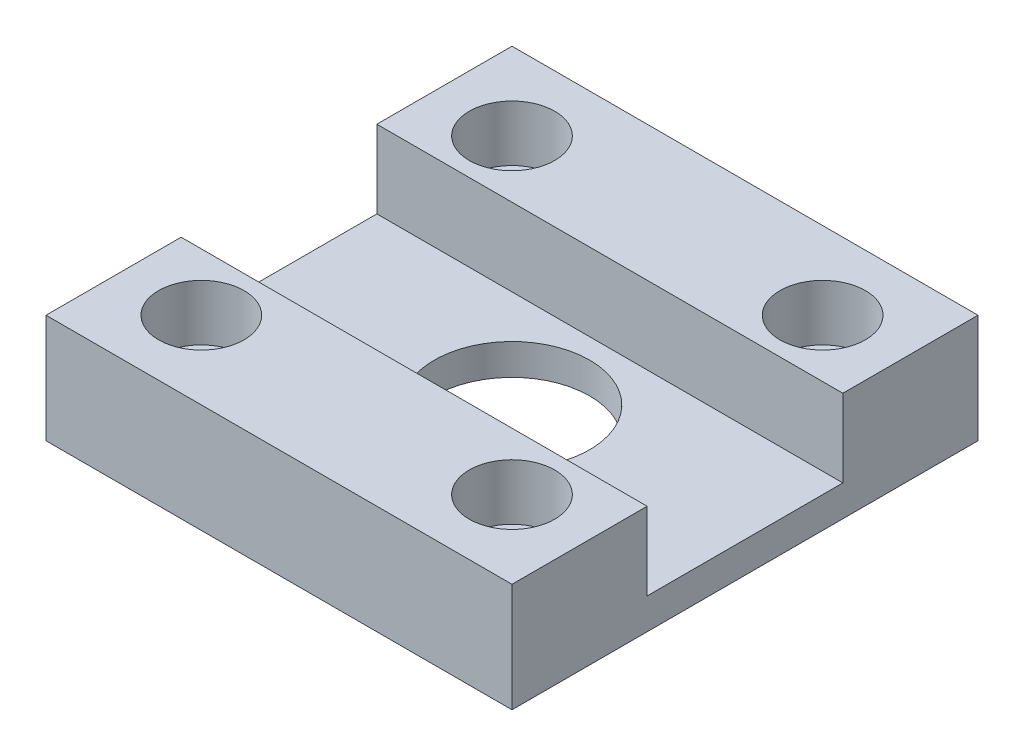
ISO-10303-21;
HEADER;
FILE_DESCRIPTION(('STEP AP214'),'2;1');
FILE_NAME('part.step','',(''),(''),'','','');
FILE_SCHEMA(('AUTOMOTIVE_DESIGN { 1 0 10303 214 1 1 1 1 }'));
ENDSEC;
DATA;
#1=APPLICATION_CONTEXT('core data for automotive mechanical design processes');
#2=APPLICATION_PROTOCOL_DEFINITION('international standard','automotive_design',2000,#1);
#3=PRODUCT_CONTEXT('',#1,'mechanical');
#4=PRODUCT('Part','Part','',(#3));
#5=PRODUCT_RELATED_PRODUCT_CATEGORY('part','',(#4));
#6=PRODUCT_DEFINITION_FORMATION('','',#4);
#7=PRODUCT_DEFINITION_CONTEXT('part definition',#1,'design');
#8=PRODUCT_DEFINITION('design','',#6,#7);
#9=PRODUCT_DEFINITION_SHAPE('','',#8);
#10=(LENGTH_UNIT() NAMED_UNIT(*) SI_UNIT(.MILLI.,.METRE.));
#11=(NAMED_UNIT(*) PLANE_ANGLE_UNIT() SI_UNIT($,.RADIAN.));
#12=(NAMED_UNIT(*) SI_UNIT($,.STERADIAN.) SOLID_ANGLE_UNIT());
#13=UNCERTAINTY_MEASURE_WITH_UNIT(LENGTH_MEASURE(1.E-05),#10,'distance_accuracy_value','');
#14=(GEOMETRIC_REPRESENTATION_CONTEXT(3) GLOBAL_UNCERTAINTY_ASSIGNED_CONTEXT((#13)) GLOBAL_UNIT_ASSIGNED_CONTEXT((#10,
#11,#12)) REPRESENTATION_CONTEXT('',''));
#15=CARTESIAN_POINT('',(0.,0.,0.));
#16=DIRECTION('',(0.,0.,1.));
#17=DIRECTION('',(1.,0.,0.));
#18=AXIS2_PLACEMENT_3D('',#15,#16,#17);
#19=CARTESIAN_POINT('',(0.,2.54,0.));
#20=DIRECTION('',(0.,-1.,0.));
#21=DIRECTION('',(0.,0.,-1.));
#22=AXIS2_PLACEMENT_3D('',#19,#20,#21);
#23=PLANE('',#22);
#24=CARTESIAN_POINT('',(0.,2.54,0.));
#25=DIRECTION('',(0.,1.,0.));
#26=DIRECTION('',(0.,0.,1.));
#27=AXIS2_PLACEMENT_3D('',#24,#25,#26);
#28=CIRCLE('',#27,6.35);
#29=CARTESIAN_POINT('',(0.,2.54,6.35));
#30=VERTEX_POINT('',#29);
#31=EDGE_CURVE('E175',#30,#30,#28,.T.);
#32=ORIENTED_EDGE('',*,*,#31,.F.);
#33=EDGE_LOOP('',(#32));
#34=FACE_BOUND('',#33,.T.);
#35=DIRECTION('',(-1.,0.,0.));
#36=VECTOR('',#35,1.);
#37=CARTESIAN_POINT('',(-19.05,2.54,8.001));
#38=LINE('',#37,#36);
#39=CARTESIAN_POINT('',(19.05,2.54,8.001));
#40=VERTEX_POINT('',#39);
#41=CARTESIAN_POINT('',(-19.05,2.54,8.001));
#42=VERTEX_POINT('',#41);
#43=EDGE_CURVE('E52',#40,#42,#38,.T.);
#44=ORIENTED_EDGE('',*,*,#43,.F.);
#45=DIRECTION('',(0.,0.,-1.));
#46=VECTOR('',#45,1.);
#47=CARTESIAN_POINT('',(19.05,2.54,19.05));
#48=LINE('',#47,#46);
#49=CARTESIAN_POINT('',(19.05,2.54,-8.001));
#50=VERTEX_POINT('',#49);
#51=EDGE_CURVE('E160',#40,#50,#48,.T.);
#52=ORIENTED_EDGE('',*,*,#51,.T.);
#53=DIRECTION('',(1.,0.,0.));
#54=VECTOR('',#53,1.);
#55=CARTESIAN_POINT('',(-19.05,2.54,-8.001));
#56=LINE('',#55,#54);
#57=CARTESIAN_POINT('',(-19.05,2.54,-8.00099999999999));
#58=VERTEX_POINT('',#57);
#59=EDGE_CURVE('E139',#58,#50,#56,.T.);
#60=ORIENTED_EDGE('',*,*,#59,.F.);
#61=DIRECTION('',(0.,0.,1.));
#62=VECTOR('',#61,1.);
#63=CARTESIAN_POINT('',(-19.05,2.54,19.05));
#64=LINE('',#63,#62);
#65=EDGE_CURVE('E57',#58,#42,#64,.T.);
#66=ORIENTED_EDGE('',*,*,#65,.T.);
#67=EDGE_LOOP('',(#44,#52,#60,#66));
#68=FACE_BOUND('',#67,.T.);
#69=ADVANCED_FACE('F35',(#34,#68),#23,.F.);
#70=CARTESIAN_POINT('',(19.05,2.54,19.05));
#71=DIRECTION('',(-1.,0.,0.));
#72=DIRECTION('',(0.,0.,1.));
#73=AXIS2_PLACEMENT_3D('',#70,#71,#72);
#74=PLANE('',#73);
#75=DIRECTION('',(0.,0.,-1.));
#76=VECTOR('',#75,1.);
#77=CARTESIAN_POINT('',(19.05,0.,19.05));
#78=LINE('',#77,#76);
#79=CARTESIAN_POINT('',(19.05,0.,19.05));
#80=VERTEX_POINT('',#79);
#81=CARTESIAN_POINT('',(19.05,0.,-19.05));
#82=VERTEX_POINT('',#81);
#83=EDGE_CURVE('E159',#80,#82,#78,.T.);
#84=ORIENTED_EDGE('',*,*,#83,.T.);
#85=DIRECTION('',(0.,-1.,0.));
#86=VECTOR('',#85,1.);
#87=CARTESIAN_POINT('',(19.05,2.54,-19.05));
#88=LINE('',#87,#86);
#89=CARTESIAN_POINT('',(19.05,8.89,-19.05));
#90=VERTEX_POINT('',#89);
#91=EDGE_CURVE('E11',#90,#82,#88,.T.);
#92=ORIENTED_EDGE('',*,*,#91,.F.);
#93=DIRECTION('',(0.,0.,-1.));
#94=VECTOR('',#93,1.);
#95=CARTESIAN_POINT('',(19.05,8.89,-19.05));
#96=LINE('',#95,#94);
#97=CARTESIAN_POINT('',(19.05,8.89,-8.001));
#98=VERTEX_POINT('',#97);
#99=EDGE_CURVE('E145',#98,#90,#96,.T.);
#100=ORIENTED_EDGE('',*,*,#99,.F.);
#101=DIRECTION('',(0.,-1.,0.));
#102=VECTOR('',#101,1.);
#103=CARTESIAN_POINT('',(19.05,8.89,-8.001));
#104=LINE('',#103,#102);
#105=EDGE_CURVE('E151',#98,#50,#104,.T.);
#106=ORIENTED_EDGE('',*,*,#105,.T.);
#107=ORIENTED_EDGE('',*,*,#51,.F.);
#108=DIRECTION('',(0.,-1.,0.));
#109=VECTOR('',#108,1.);
#110=CARTESIAN_POINT('',(19.05,8.89,8.001));
#111=LINE('',#110,#109);
#112=CARTESIAN_POINT('',(19.05,8.89,8.001));
#113=VERTEX_POINT('',#112);
#114=EDGE_CURVE('E136',#113,#40,#111,.T.);
#115=ORIENTED_EDGE('',*,*,#114,.F.);
#116=DIRECTION('',(0.,0.,-1.));
#117=VECTOR('',#116,1.);
#118=CARTESIAN_POINT('',(19.05,8.89,19.05));
#119=LINE('',#118,#117);
#120=CARTESIAN_POINT('',(19.05,8.89,19.05));
#121=VERTEX_POINT('',#120);
#122=EDGE_CURVE('E119',#121,#113,#119,.T.);
#123=ORIENTED_EDGE('',*,*,#122,.F.);
#124=DIRECTION('',(0.,-1.,0.));
#125=VECTOR('',#124,1.);
#126=CARTESIAN_POINT('',(19.05,2.54,19.05));
#127=LINE('',#126,#125);
#128=EDGE_CURVE('E111',#121,#80,#127,.T.);
#129=ORIENTED_EDGE('',*,*,#128,.T.);
#130=EDGE_LOOP('',(#84,#92,#100,#106,#107,#115,#123,#129));
#131=FACE_BOUND('',#130,.T.);
#132=ADVANCED_FACE('F37',(#131),#74,.F.);
#133=CARTESIAN_POINT('',(-19.05,2.54,-19.05));
#134=DIRECTION('',(0.,0.,1.));
#135=DIRECTION('',(1.,0.,0.));
#136=AXIS2_PLACEMENT_3D('',#133,#134,#135);
#137=PLANE('',#136);
#138=DIRECTION('',(-1.,0.,0.));
#139=VECTOR('',#138,1.);
#140=CARTESIAN_POINT('',(-19.05,0.,-19.05));
#141=LINE('',#140,#139);
#142=CARTESIAN_POINT('',(-19.05,0.,-19.05));
#143=VERTEX_POINT('',#142);
#144=EDGE_CURVE('E166',#82,#143,#141,.T.);
#145=ORIENTED_EDGE('',*,*,#144,.T.);
#146=DIRECTION('',(0.,-1.,0.));
#147=VECTOR('',#146,1.);
#148=CARTESIAN_POINT('',(-19.05,2.54,-19.05));
#149=LINE('',#148,#147);
#150=CARTESIAN_POINT('',(-19.05,8.89,-19.05));
#151=VERTEX_POINT('',#150);
#152=EDGE_CURVE('E44',#151,#143,#149,.T.);
#153=ORIENTED_EDGE('',*,*,#152,.F.);
#154=DIRECTION('',(-1.,0.,0.));
#155=VECTOR('',#154,1.);
#156=CARTESIAN_POINT('',(-19.05,8.89,-19.05));
#157=LINE('',#156,#155);
#158=EDGE_CURVE('E148',#90,#151,#157,.T.);
#159=ORIENTED_EDGE('',*,*,#158,.F.);
#160=ORIENTED_EDGE('',*,*,#91,.T.);
#161=EDGE_LOOP('',(#145,#153,#159,#160));
#162=FACE_BOUND('',#161,.T.);
#163=ADVANCED_FACE('F240',(#162),#137,.F.);
#164=CARTESIAN_POINT('',(-19.05,2.54,19.05));
#165=DIRECTION('',(1.,0.,0.));
#166=DIRECTION('',(0.,0.,-1.));
#167=AXIS2_PLACEMENT_3D('',#164,#165,#166);
#168=PLANE('',#167);
#169=DIRECTION('',(0.,0.,1.));
#170=VECTOR('',#169,1.);
#171=CARTESIAN_POINT('',(-19.05,0.,19.05));
#172=LINE('',#171,#170);
#173=CARTESIAN_POINT('',(-19.05,0.,19.05));
#174=VERTEX_POINT('',#173);
#175=EDGE_CURVE('E108',#143,#174,#172,.T.);
#176=ORIENTED_EDGE('',*,*,#175,.T.);
#177=DIRECTION('',(0.,-1.,0.));
#178=VECTOR('',#177,1.);
#179=CARTESIAN_POINT('',(-19.05,2.54,19.05));
#180=LINE('',#179,#178);
#181=CARTESIAN_POINT('',(-19.05,8.89,19.05));
#182=VERTEX_POINT('',#181);
#183=EDGE_CURVE('E100',#182,#174,#180,.T.);
#184=ORIENTED_EDGE('',*,*,#183,.F.);
#185=DIRECTION('',(0.,0.,1.));
#186=VECTOR('',#185,1.);
#187=CARTESIAN_POINT('',(-19.05,8.89,19.05));
#188=LINE('',#187,#186);
#189=CARTESIAN_POINT('',(-19.05,8.89,8.001));
#190=VERTEX_POINT('',#189);
#191=EDGE_CURVE('E105',#190,#182,#188,.T.);
#192=ORIENTED_EDGE('',*,*,#191,.F.);
#193=DIRECTION('',(0.,-1.,0.));
#194=VECTOR('',#193,1.);
#195=CARTESIAN_POINT('',(-19.05,8.89,8.001));
#196=LINE('',#195,#194);
#197=EDGE_CURVE('E133',#190,#42,#196,.T.);
#198=ORIENTED_EDGE('',*,*,#197,.T.);
#199=ORIENTED_EDGE('',*,*,#65,.F.);
#200=DIRECTION('',(0.,-1.,0.));
#201=VECTOR('',#200,1.);
#202=CARTESIAN_POINT('',(-19.05,8.89,-8.001));
#203=LINE('',#202,#201);
#204=CARTESIAN_POINT('',(-19.05,8.89,-8.001));
#205=VERTEX_POINT('',#204);
#206=EDGE_CURVE('E156',#205,#58,#203,.T.);
#207=ORIENTED_EDGE('',*,*,#206,.F.);
#208=DIRECTION('',(0.,0.,1.));
#209=VECTOR('',#208,1.);
#210=CARTESIAN_POINT('',(-19.05,8.89,-19.05));
#211=LINE('',#210,#209);
#212=EDGE_CURVE('E140',#151,#205,#211,.T.);
#213=ORIENTED_EDGE('',*,*,#212,.F.);
#214=ORIENTED_EDGE('',*,*,#152,.T.);
#215=EDGE_LOOP('',(#176,#184,#192,#198,#199,#207,#213,#214));
#216=FACE_BOUND('',#215,.T.);
#217=ADVANCED_FACE('F102',(#216),#168,.F.);
#218=CARTESIAN_POINT('',(-19.05,2.54,19.05));
#219=DIRECTION('',(0.,0.,-1.));
#220=DIRECTION('',(-1.,0.,0.));
#221=AXIS2_PLACEMENT_3D('',#218,#219,#220);
#222=PLANE('',#221);
#223=DIRECTION('',(1.,0.,0.));
#224=VECTOR('',#223,1.);
#225=CARTESIAN_POINT('',(-19.05,0.,19.05));
#226=LINE('',#225,#224);
#227=EDGE_CURVE('E162',#174,#80,#226,.T.);
#228=ORIENTED_EDGE('',*,*,#227,.T.);
#229=ORIENTED_EDGE('',*,*,#128,.F.);
#230=DIRECTION('',(1.,0.,0.));
#231=VECTOR('',#230,1.);
#232=CARTESIAN_POINT('',(-19.05,8.89,19.05));
#233=LINE('',#232,#231);
#234=EDGE_CURVE('E114',#182,#121,#233,.T.);
#235=ORIENTED_EDGE('',*,*,#234,.F.);
#236=ORIENTED_EDGE('',*,*,#183,.T.);
#237=EDGE_LOOP('',(#228,#229,#235,#236));
#238=FACE_BOUND('',#237,.T.);
#239=ADVANCED_FACE('F115',(#238),#222,.F.);
#240=CARTESIAN_POINT('',(0.,0.,0.));
#241=DIRECTION('',(0.,-1.,0.));
#242=DIRECTION('',(0.,0.,-1.));
#243=AXIS2_PLACEMENT_3D('',#240,#241,#242);
#244=PLANE('',#243);
#245=CARTESIAN_POINT('',(-12.7,0.,-12.6999999999998));
#246=DIRECTION('',(0.,1.,0.));
#247=DIRECTION('',(0.,0.,1.));
#248=AXIS2_PLACEMENT_3D('',#245,#246,#247);
#249=CIRCLE('',#248,2.2225);
#250=CARTESIAN_POINT('',(-12.7,0.,-10.4774999999998));
#251=VERTEX_POINT('',#250);
#252=EDGE_CURVE('E180',#251,#251,#249,.T.);
#253=ORIENTED_EDGE('',*,*,#252,.T.);
#254=EDGE_LOOP('',(#253));
#255=FACE_BOUND('',#254,.T.);
#256=CARTESIAN_POINT('',(-12.6999999999997,0.,12.7000000000002));
#257=DIRECTION('',(0.,1.,0.));
#258=DIRECTION('',(0.,0.,1.));
#259=AXIS2_PLACEMENT_3D('',#256,#257,#258);
#260=CIRCLE('',#259,2.2225);
#261=CARTESIAN_POINT('',(-12.6999999999997,0.,14.9225000000002));
#262=VERTEX_POINT('',#261);
#263=EDGE_CURVE('E453',#262,#262,#260,.T.);
#264=ORIENTED_EDGE('',*,*,#263,.T.);
#265=EDGE_LOOP('',(#264));
#266=FACE_BOUND('',#265,.T.);
#267=CARTESIAN_POINT('',(12.7000000000003,0.,12.7));
#268=DIRECTION('',(0.,1.,0.));
#269=DIRECTION('',(0.,0.,1.));
#270=AXIS2_PLACEMENT_3D('',#267,#268,#269);
#271=CIRCLE('',#270,2.2225);
#272=CARTESIAN_POINT('',(12.7000000000003,0.,14.9225));
#273=VERTEX_POINT('',#272);
#274=EDGE_CURVE('E193',#273,#273,#271,.T.);
#275=ORIENTED_EDGE('',*,*,#274,.T.);
#276=EDGE_LOOP('',(#275));
#277=FACE_BOUND('',#276,.T.);
#278=CARTESIAN_POINT('',(12.7,0.,-12.7));
#279=DIRECTION('',(0.,1.,0.));
#280=DIRECTION('',(0.,0.,1.));
#281=AXIS2_PLACEMENT_3D('',#278,#279,#280);
#282=CIRCLE('',#281,2.2225);
#283=CARTESIAN_POINT('',(12.7,0.,-10.4775));
#284=VERTEX_POINT('',#283);
#285=EDGE_CURVE('E176',#284,#284,#282,.T.);
#286=ORIENTED_EDGE('',*,*,#285,.T.);
#287=EDGE_LOOP('',(#286));
#288=FACE_BOUND('',#287,.T.);
#289=CARTESIAN_POINT('',(0.,0.,0.));
#290=DIRECTION('',(0.,1.,0.));
#291=DIRECTION('',(0.,0.,1.));
#292=AXIS2_PLACEMENT_3D('',#289,#290,#291);
#293=CIRCLE('',#292,6.35);
#294=CARTESIAN_POINT('',(0.,0.,6.35));
#295=VERTEX_POINT('',#294);
#296=EDGE_CURVE('E195',#295,#295,#293,.T.);
#297=ORIENTED_EDGE('',*,*,#296,.T.);
#298=EDGE_LOOP('',(#297));
#299=FACE_BOUND('',#298,.T.);
#300=ORIENTED_EDGE('',*,*,#83,.F.);
#301=ORIENTED_EDGE('',*,*,#227,.F.);
#302=ORIENTED_EDGE('',*,*,#175,.F.);
#303=ORIENTED_EDGE('',*,*,#144,.F.);
#304=EDGE_LOOP('',(#300,#301,#302,#303));
#305=FACE_BOUND('',#304,.T.);
#306=ADVANCED_FACE('F243',(#255,#266,#277,#288,#299,#305),#244,.T.);
#307=CARTESIAN_POINT('',(-19.05,8.89,-8.001));
#308=DIRECTION('',(0.,0.,-1.));
#309=DIRECTION('',(-1.,0.,0.));
#310=AXIS2_PLACEMENT_3D('',#307,#308,#309);
#311=PLANE('',#310);
#312=ORIENTED_EDGE('',*,*,#59,.T.);
#313=ORIENTED_EDGE('',*,*,#105,.F.);
#314=DIRECTION('',(1.,0.,0.));
#315=VECTOR('',#314,1.);
#316=CARTESIAN_POINT('',(-19.05,8.89,-8.001));
#317=LINE('',#316,#315);
#318=EDGE_CURVE('E143',#205,#98,#317,.T.);
#319=ORIENTED_EDGE('',*,*,#318,.F.);
#320=ORIENTED_EDGE('',*,*,#206,.T.);
#321=EDGE_LOOP('',(#312,#313,#319,#320));
#322=FACE_BOUND('',#321,.T.);
#323=ADVANCED_FACE('F229',(#322),#311,.F.);
#324=CARTESIAN_POINT('',(0.,8.89,0.));
#325=DIRECTION('',(0.,1.,0.));
#326=DIRECTION('',(0.,0.,1.));
#327=AXIS2_PLACEMENT_3D('',#324,#325,#326);
#328=PLANE('',#327);
#329=CARTESIAN_POINT('',(12.7,8.89,-12.7));
#330=DIRECTION('',(0.,1.,0.));
#331=DIRECTION('',(0.,0.,1.));
#332=AXIS2_PLACEMENT_3D('',#329,#330,#331);
#333=CIRCLE('',#332,3.4925);
#334=CARTESIAN_POINT('',(12.7,8.89,-9.2075));
#335=VERTEX_POINT('',#334);
#336=EDGE_CURVE('E204',#335,#335,#333,.T.);
#337=ORIENTED_EDGE('',*,*,#336,.F.);
#338=EDGE_LOOP('',(#337));
#339=FACE_BOUND('',#338,.T.);
#340=CARTESIAN_POINT('',(-12.7,8.89,-12.7));
#341=DIRECTION('',(0.,1.,0.));
#342=DIRECTION('',(0.,0.,1.));
#343=AXIS2_PLACEMENT_3D('',#340,#341,#342);
#344=CIRCLE('',#343,3.4925);
#345=CARTESIAN_POINT('',(-12.7,8.89,-9.2075));
#346=VERTEX_POINT('',#345);
#347=EDGE_CURVE('E129',#346,#346,#344,.T.);
#348=ORIENTED_EDGE('',*,*,#347,.F.);
#349=EDGE_LOOP('',(#348));
#350=FACE_BOUND('',#349,.T.);
#351=ORIENTED_EDGE('',*,*,#212,.T.);
#352=ORIENTED_EDGE('',*,*,#318,.T.);
#353=ORIENTED_EDGE('',*,*,#99,.T.);
#354=ORIENTED_EDGE('',*,*,#158,.T.);
#355=EDGE_LOOP('',(#351,#352,#353,#354));
#356=FACE_BOUND('',#355,.T.);
#357=ADVANCED_FACE('F225',(#339,#350,#356),#328,.T.);
#358=CARTESIAN_POINT('',(-19.05,8.89,8.001));
#359=DIRECTION('',(0.,0.,1.));
#360=DIRECTION('',(1.,0.,0.));
#361=AXIS2_PLACEMENT_3D('',#358,#359,#360);
#362=PLANE('',#361);
#363=ORIENTED_EDGE('',*,*,#43,.T.);
#364=ORIENTED_EDGE('',*,*,#197,.F.);
#365=DIRECTION('',(-1.,0.,0.));
#366=VECTOR('',#365,1.);
#367=CARTESIAN_POINT('',(-19.05,8.89,8.001));
#368=LINE('',#367,#366);
#369=EDGE_CURVE('E123',#113,#190,#368,.T.);
#370=ORIENTED_EDGE('',*,*,#369,.F.);
#371=ORIENTED_EDGE('',*,*,#114,.T.);
#372=EDGE_LOOP('',(#363,#364,#370,#371));
#373=FACE_BOUND('',#372,.T.);
#374=ADVANCED_FACE('F228',(#373),#362,.F.);
#375=CARTESIAN_POINT('',(0.,8.89,0.));
#376=DIRECTION('',(0.,-1.,0.));
#377=DIRECTION('',(0.,0.,-1.));
#378=AXIS2_PLACEMENT_3D('',#375,#376,#377);
#379=PLANE('',#378);
#380=CARTESIAN_POINT('',(12.7000000000003,8.89,12.7));
#381=DIRECTION('',(0.,1.,0.));
#382=DIRECTION('',(0.,0.,1.));
#383=AXIS2_PLACEMENT_3D('',#380,#381,#382);
#384=CIRCLE('',#383,3.4925);
#385=CARTESIAN_POINT('',(12.7000000000003,8.89,16.1925));
#386=VERTEX_POINT('',#385);
#387=EDGE_CURVE('E210',#386,#386,#384,.T.);
#388=ORIENTED_EDGE('',*,*,#387,.F.);
#389=EDGE_LOOP('',(#388));
#390=FACE_BOUND('',#389,.T.);
#391=CARTESIAN_POINT('',(-12.6999999999997,8.89,12.7));
#392=DIRECTION('',(0.,1.,0.));
#393=DIRECTION('',(0.,0.,1.));
#394=AXIS2_PLACEMENT_3D('',#391,#392,#393);
#395=CIRCLE('',#394,3.4925);
#396=CARTESIAN_POINT('',(-12.6999999999997,8.89,16.1925));
#397=VERTEX_POINT('',#396);
#398=EDGE_CURVE('E198',#397,#397,#395,.T.);
#399=ORIENTED_EDGE('',*,*,#398,.F.);
#400=EDGE_LOOP('',(#399));
#401=FACE_BOUND('',#400,.T.);
#402=ORIENTED_EDGE('',*,*,#191,.T.);
#403=ORIENTED_EDGE('',*,*,#234,.T.);
#404=ORIENTED_EDGE('',*,*,#122,.T.);
#405=ORIENTED_EDGE('',*,*,#369,.T.);
#406=EDGE_LOOP('',(#402,#403,#404,#405));
#407=FACE_BOUND('',#406,.T.);
#408=ADVANCED_FACE('F121',(#390,#401,#407),#379,.F.);
#409=CARTESIAN_POINT('',(-12.7,4.318,-12.7));
#410=DIRECTION('',(0.,1.,0.));
#411=DIRECTION('',(0.,0.,1.));
#412=AXIS2_PLACEMENT_3D('',#409,#410,#411);
#413=CYLINDRICAL_SURFACE('',#412,3.4925);
#414=CARTESIAN_POINT('',(-12.7,4.318,-12.7));
#415=DIRECTION('',(0.,1.,0.));
#416=DIRECTION('',(0.,0.,1.));
#417=AXIS2_PLACEMENT_3D('',#414,#415,#416);
#418=CIRCLE('',#417,3.4925);
#419=CARTESIAN_POINT('',(-12.7,4.318,-9.2075));
#420=VERTEX_POINT('',#419);
#421=EDGE_CURVE('E126',#420,#420,#418,.T.);
#422=ORIENTED_EDGE('',*,*,#421,.F.);
#423=EDGE_LOOP('',(#422));
#424=FACE_BOUND('',#423,.T.);
#425=ORIENTED_EDGE('',*,*,#347,.T.);
#426=EDGE_LOOP('',(#425));
#427=FACE_BOUND('',#426,.T.);
#428=ADVANCED_FACE('F223',(#424,#427),#413,.F.);
#429=CARTESIAN_POINT('',(-12.7,4.318,-12.7));
#430=DIRECTION('',(0.,1.,0.));
#431=DIRECTION('',(0.,0.,1.));
#432=AXIS2_PLACEMENT_3D('',#429,#430,#431);
#433=PLANE('',#432);
#434=CARTESIAN_POINT('',(-12.7,4.318,-12.6999999999998));
#435=DIRECTION('',(0.,1.,0.));
#436=DIRECTION('',(0.,0.,1.));
#437=AXIS2_PLACEMENT_3D('',#434,#435,#436);
#438=CIRCLE('',#437,2.2225);
#439=CARTESIAN_POINT('',(-12.7,4.318,-10.4774999999998));
#440=VERTEX_POINT('',#439);
#441=EDGE_CURVE('E39',#440,#440,#438,.T.);
#442=ORIENTED_EDGE('',*,*,#441,.F.);
#443=EDGE_LOOP('',(#442));
#444=FACE_BOUND('',#443,.T.);
#445=ORIENTED_EDGE('',*,*,#421,.T.);
#446=EDGE_LOOP('',(#445));
#447=FACE_BOUND('',#446,.T.);
#448=ADVANCED_FACE('F313',(#444,#447),#433,.T.);
#449=CARTESIAN_POINT('',(-12.6999999999997,4.318,12.7));
#450=DIRECTION('',(0.,1.,0.));
#451=DIRECTION('',(0.,0.,1.));
#452=AXIS2_PLACEMENT_3D('',#449,#450,#451);
#453=CYLINDRICAL_SURFACE('',#452,3.4925);
#454=CARTESIAN_POINT('',(-12.6999999999997,4.318,12.7));
#455=DIRECTION('',(0.,1.,0.));
#456=DIRECTION('',(0.,0.,1.));
#457=AXIS2_PLACEMENT_3D('',#454,#455,#456);
#458=CIRCLE('',#457,3.4925);
#459=CARTESIAN_POINT('',(-12.6999999999997,4.318,16.1925));
#460=VERTEX_POINT('',#459);
#461=EDGE_CURVE('E213',#460,#460,#458,.T.);
#462=ORIENTED_EDGE('',*,*,#461,.F.);
#463=EDGE_LOOP('',(#462));
#464=FACE_BOUND('',#463,.T.);
#465=ORIENTED_EDGE('',*,*,#398,.T.);
#466=EDGE_LOOP('',(#465));
#467=FACE_BOUND('',#466,.T.);
#468=ADVANCED_FACE('F321',(#464,#467),#453,.F.);
#469=CARTESIAN_POINT('',(-12.6999999999997,4.318,12.7));
#470=DIRECTION('',(0.,1.,0.));
#471=DIRECTION('',(0.,0.,1.));
#472=AXIS2_PLACEMENT_3D('',#469,#470,#471);
#473=PLANE('',#472);
#474=CARTESIAN_POINT('',(-12.6999999999997,4.318,12.7000000000002));
#475=DIRECTION('',(0.,1.,0.));
#476=DIRECTION('',(0.,0.,1.));
#477=AXIS2_PLACEMENT_3D('',#474,#475,#476);
#478=CIRCLE('',#477,2.2225);
#479=CARTESIAN_POINT('',(-12.6999999999997,4.318,14.9225000000002));
#480=VERTEX_POINT('',#479);
#481=EDGE_CURVE('E179',#480,#480,#478,.T.);
#482=ORIENTED_EDGE('',*,*,#481,.F.);
#483=EDGE_LOOP('',(#482));
#484=FACE_BOUND('',#483,.T.);
#485=ORIENTED_EDGE('',*,*,#461,.T.);
#486=EDGE_LOOP('',(#485));
#487=FACE_BOUND('',#486,.T.);
#488=ADVANCED_FACE('F326',(#484,#487),#473,.T.);
#489=CARTESIAN_POINT('',(12.7000000000003,4.318,12.7));
#490=DIRECTION('',(0.,1.,0.));
#491=DIRECTION('',(0.,0.,1.));
#492=AXIS2_PLACEMENT_3D('',#489,#490,#491);
#493=CYLINDRICAL_SURFACE('',#492,3.4925);
#494=CARTESIAN_POINT('',(12.7000000000003,4.318,12.7));
#495=DIRECTION('',(0.,1.,0.));
#496=DIRECTION('',(0.,0.,1.));
#497=AXIS2_PLACEMENT_3D('',#494,#495,#496);
#498=CIRCLE('',#497,3.4925);
#499=CARTESIAN_POINT('',(12.7000000000003,4.318,16.1925));
#500=VERTEX_POINT('',#499);
#501=EDGE_CURVE('E207',#500,#500,#498,.T.);
#502=ORIENTED_EDGE('',*,*,#501,.F.);
#503=EDGE_LOOP('',(#502));
#504=FACE_BOUND('',#503,.T.);
#505=ORIENTED_EDGE('',*,*,#387,.T.);
#506=EDGE_LOOP('',(#505));
#507=FACE_BOUND('',#506,.T.);
#508=ADVANCED_FACE('F334',(#504,#507),#493,.F.);
#509=CARTESIAN_POINT('',(12.7000000000003,4.318,12.7));
#510=DIRECTION('',(0.,1.,0.));
#511=DIRECTION('',(0.,0.,1.));
#512=AXIS2_PLACEMENT_3D('',#509,#510,#511);
#513=PLANE('',#512);
#514=CARTESIAN_POINT('',(12.7000000000003,4.318,12.7));
#515=DIRECTION('',(0.,1.,0.));
#516=DIRECTION('',(0.,0.,1.));
#517=AXIS2_PLACEMENT_3D('',#514,#515,#516);
#518=CIRCLE('',#517,2.2225);
#519=CARTESIAN_POINT('',(12.7000000000003,4.318,14.9225));
#520=VERTEX_POINT('',#519);
#521=EDGE_CURVE('E177',#520,#520,#518,.T.);
#522=ORIENTED_EDGE('',*,*,#521,.F.);
#523=EDGE_LOOP('',(#522));
#524=FACE_BOUND('',#523,.T.);
#525=ORIENTED_EDGE('',*,*,#501,.T.);
#526=EDGE_LOOP('',(#525));
#527=FACE_BOUND('',#526,.T.);
#528=ADVANCED_FACE('F339',(#524,#527),#513,.T.);
#529=CARTESIAN_POINT('',(12.7,4.318,-12.7));
#530=DIRECTION('',(0.,1.,0.));
#531=DIRECTION('',(0.,0.,1.));
#532=AXIS2_PLACEMENT_3D('',#529,#530,#531);
#533=CYLINDRICAL_SURFACE('',#532,3.4925);
#534=CARTESIAN_POINT('',(12.7,4.318,-12.7));
#535=DIRECTION('',(0.,1.,0.));
#536=DIRECTION('',(0.,0.,1.));
#537=AXIS2_PLACEMENT_3D('',#534,#535,#536);
#538=CIRCLE('',#537,3.4925);
#539=CARTESIAN_POINT('',(12.7,4.318,-9.2075));
#540=VERTEX_POINT('',#539);
#541=EDGE_CURVE('E201',#540,#540,#538,.T.);
#542=ORIENTED_EDGE('',*,*,#541,.F.);
#543=EDGE_LOOP('',(#542));
#544=FACE_BOUND('',#543,.T.);
#545=ORIENTED_EDGE('',*,*,#336,.T.);
#546=EDGE_LOOP('',(#545));
#547=FACE_BOUND('',#546,.T.);
#548=ADVANCED_FACE('F347',(#544,#547),#533,.F.);
#549=CARTESIAN_POINT('',(12.7,4.318,-12.7));
#550=DIRECTION('',(0.,1.,0.));
#551=DIRECTION('',(0.,0.,1.));
#552=AXIS2_PLACEMENT_3D('',#549,#550,#551);
#553=PLANE('',#552);
#554=CARTESIAN_POINT('',(12.7,4.318,-12.7));
#555=DIRECTION('',(0.,1.,0.));
#556=DIRECTION('',(0.,0.,1.));
#557=AXIS2_PLACEMENT_3D('',#554,#555,#556);
#558=CIRCLE('',#557,2.2225);
#559=CARTESIAN_POINT('',(12.7,4.318,-10.4775));
#560=VERTEX_POINT('',#559);
#561=EDGE_CURVE('E172',#560,#560,#558,.T.);
#562=ORIENTED_EDGE('',*,*,#561,.F.);
#563=EDGE_LOOP('',(#562));
#564=FACE_BOUND('',#563,.T.);
#565=ORIENTED_EDGE('',*,*,#541,.T.);
#566=EDGE_LOOP('',(#565));
#567=FACE_BOUND('',#566,.T.);
#568=ADVANCED_FACE('F351',(#564,#567),#553,.T.);
#569=CARTESIAN_POINT('',(0.,0.,0.));
#570=DIRECTION('',(0.,1.,0.));
#571=DIRECTION('',(0.,0.,1.));
#572=AXIS2_PLACEMENT_3D('',#569,#570,#571);
#573=CYLINDRICAL_SURFACE('',#572,6.35);
#574=ORIENTED_EDGE('',*,*,#296,.F.);
#575=EDGE_LOOP('',(#574));
#576=FACE_BOUND('',#575,.T.);
#577=ORIENTED_EDGE('',*,*,#31,.T.);
#578=EDGE_LOOP('',(#577));
#579=FACE_BOUND('',#578,.T.);
#580=ADVANCED_FACE('F364',(#576,#579),#573,.F.);
#581=CARTESIAN_POINT('',(12.7,0.,-12.7));
#582=DIRECTION('',(0.,1.,0.));
#583=DIRECTION('',(0.,0.,1.));
#584=AXIS2_PLACEMENT_3D('',#581,#582,#583);
#585=CYLINDRICAL_SURFACE('',#584,2.2225);
#586=CARTESIAN_POINT('',(12.7,4.318,-10.4775));
#587=CARTESIAN_POINT('',(12.7,4.27302083333333,-10.4775));
#588=CARTESIAN_POINT('',(12.7,4.22804166666667,-10.4775));
#589=CARTESIAN_POINT('',(12.7,4.13808333333333,-10.4775));
#590=CARTESIAN_POINT('',(12.7,4.09310416666667,-10.4775));
#591=CARTESIAN_POINT('',(12.7,4.00314583333333,-10.4775));
#592=CARTESIAN_POINT('',(12.7,3.95816666666667,-10.4775));
#593=CARTESIAN_POINT('',(12.7,3.86820833333333,-10.4775));
#594=CARTESIAN_POINT('',(12.7,3.82322916666667,-10.4775));
#595=CARTESIAN_POINT('',(12.7,3.73327083333333,-10.4775));
#596=CARTESIAN_POINT('',(12.7,3.68829166666667,-10.4775));
#597=CARTESIAN_POINT('',(12.7,3.59833333333333,-10.4775));
#598=CARTESIAN_POINT('',(12.7,3.55335416666667,-10.4775));
#599=CARTESIAN_POINT('',(12.7,3.46339583333333,-10.4775));
#600=CARTESIAN_POINT('',(12.7,3.41841666666667,-10.4775));
#601=CARTESIAN_POINT('',(12.7,3.32845833333333,-10.4775));
#602=CARTESIAN_POINT('',(12.7,3.28347916666667,-10.4775));
#603=CARTESIAN_POINT('',(12.7,3.19352083333333,-10.4775));
#604=CARTESIAN_POINT('',(12.7,3.14854166666667,-10.4775));
#605=CARTESIAN_POINT('',(12.7,3.05858333333333,-10.4775));
#606=CARTESIAN_POINT('',(12.7,3.01360416666667,-10.4775));
#607=CARTESIAN_POINT('',(12.7,2.92364583333333,-10.4775));
#608=CARTESIAN_POINT('',(12.7,2.87866666666667,-10.4775));
#609=CARTESIAN_POINT('',(12.7,2.78870833333333,-10.4775));
#610=CARTESIAN_POINT('',(12.7,2.74372916666667,-10.4775));
#611=CARTESIAN_POINT('',(12.7,2.65377083333333,-10.4775));
#612=CARTESIAN_POINT('',(12.7,2.60879166666667,-10.4775));
#613=CARTESIAN_POINT('',(12.7,2.51883333333333,-10.4775));
#614=CARTESIAN_POINT('',(12.7,2.47385416666667,-10.4775));
#615=CARTESIAN_POINT('',(12.7,2.38389583333333,-10.4775));
#616=CARTESIAN_POINT('',(12.7,2.33891666666667,-10.4775));
#617=CARTESIAN_POINT('',(12.7,2.24895833333333,-10.4775));
#618=CARTESIAN_POINT('',(12.7,2.20397916666667,-10.4775));
#619=CARTESIAN_POINT('',(12.7,2.11402083333333,-10.4775));
#620=CARTESIAN_POINT('',(12.7,2.06904166666667,-10.4775));
#621=CARTESIAN_POINT('',(12.7,1.97908333333333,-10.4775));
#622=CARTESIAN_POINT('',(12.7,1.93410416666667,-10.4775));
#623=CARTESIAN_POINT('',(12.7,1.84414583333333,-10.4775));
#624=CARTESIAN_POINT('',(12.7,1.79916666666667,-10.4775));
#625=CARTESIAN_POINT('',(12.7,1.70920833333333,-10.4775));
#626=CARTESIAN_POINT('',(12.7,1.66422916666667,-10.4775));
#627=CARTESIAN_POINT('',(12.7,1.57427083333333,-10.4775));
#628=CARTESIAN_POINT('',(12.7,1.52929166666667,-10.4775));
#629=CARTESIAN_POINT('',(12.7,1.43933333333333,-10.4775));
#630=CARTESIAN_POINT('',(12.7,1.39435416666667,-10.4775));
#631=CARTESIAN_POINT('',(12.7,1.30439583333333,-10.4775));
#632=CARTESIAN_POINT('',(12.7,1.25941666666667,-10.4775));
#633=CARTESIAN_POINT('',(12.7,1.16945833333333,-10.4775));
#634=CARTESIAN_POINT('',(12.7,1.12447916666667,-10.4775));
#635=CARTESIAN_POINT('',(12.7,1.03452083333333,-10.4775));
#636=CARTESIAN_POINT('',(12.7,0.989541666666667,-10.4775));
#637=CARTESIAN_POINT('',(12.7,0.899583333333333,-10.4775));
#638=CARTESIAN_POINT('',(12.7,0.854604166666667,-10.4775));
#639=CARTESIAN_POINT('',(12.7,0.764645833333333,-10.4775));
#640=CARTESIAN_POINT('',(12.7,0.719666666666667,-10.4775));
#641=CARTESIAN_POINT('',(12.7,0.629708333333333,-10.4775));
#642=CARTESIAN_POINT('',(12.7,0.584729166666667,-10.4775));
#643=CARTESIAN_POINT('',(12.7,0.494770833333333,-10.4775));
#644=CARTESIAN_POINT('',(12.7,0.449791666666667,-10.4775));
#645=CARTESIAN_POINT('',(12.7,0.359833333333333,-10.4775));
#646=CARTESIAN_POINT('',(12.7,0.314854166666667,-10.4775));
#647=CARTESIAN_POINT('',(12.7,0.224895833333333,-10.4775));
#648=CARTESIAN_POINT('',(12.7,0.179916666666666,-10.4775));
#649=CARTESIAN_POINT('',(12.7,0.0899583333333331,-10.4775));
#650=CARTESIAN_POINT('',(12.7,0.0449791666666666,-10.4775));
#651=CARTESIAN_POINT('',(12.7,0.,-10.4775));
#652=B_SPLINE_CURVE_WITH_KNOTS('',3,(#586,#587,#588,#589,#590,#591,#592,#593,#594,#595,#596,
#597,#598,#599,#600,#601,#602,#603,#604,#605,#606,#607,#608,#609,#610,#611,#612,#613,#614,#615,
#616,#617,#618,#619,#620,#621,#622,#623,#624,#625,#626,#627,#628,#629,#630,#631,#632,#633,#634,
#635,#636,#637,#638,#639,#640,#641,#642,#643,#644,#645,#646,#647,#648,#649,#650,#651),
.UNSPECIFIED.,.F.,.F.,(4,2,2,2,2,2,2,2,2,2,2,2,2,2,2,2,2,2,2,2,2,2,2,2,2,2,2,2,2,2,2,2,4),(0.,
0.1349375,0.269875,0.4048125,0.53975,0.6746875,0.809625,0.9445625,1.0795,1.2144375,1.349375,
1.4843125,1.61925,1.7541875,1.889125,2.0240625,2.159,2.2939375,2.428875,2.5638125,2.69875,
2.8336875,2.968625,3.1035625,3.2385,3.3734375,3.508375,3.6433125,3.77825,3.9131875,4.048125,
4.1830625,4.318),.UNSPECIFIED.);
#653=EDGE_CURVE('BSEAM368',#560,#284,#652,.T.);
#654=ORIENTED_EDGE('',*,*,#561,.T.);
#655=ORIENTED_EDGE('',*,*,#285,.F.);
#656=ORIENTED_EDGE('',*,*,#653,.T.);
#657=ORIENTED_EDGE('',*,*,#653,.F.);
#658=EDGE_LOOP('',(#654,#656,#655,#657));
#659=FACE_BOUND('',#658,.T.);
#660=ADVANCED_FACE('F368',(#659),#585,.F.);
#661=CARTESIAN_POINT('',(12.7000000000003,0.,12.7));
#662=DIRECTION('',(0.,1.,0.));
#663=DIRECTION('',(0.,0.,1.));
#664=AXIS2_PLACEMENT_3D('',#661,#662,#663);
#665=CYLINDRICAL_SURFACE('',#664,2.2225);
#666=CARTESIAN_POINT('',(12.7000000000003,4.318,14.9225));
#667=CARTESIAN_POINT('',(12.7000000000003,4.27302083333333,14.9225));
#668=CARTESIAN_POINT('',(12.7000000000003,4.22804166666667,14.9225));
#669=CARTESIAN_POINT('',(12.7000000000003,4.13808333333333,14.9225));
#670=CARTESIAN_POINT('',(12.7000000000003,4.09310416666667,14.9225));
#671=CARTESIAN_POINT('',(12.7000000000003,4.00314583333333,14.9225));
#672=CARTESIAN_POINT('',(12.7000000000003,3.95816666666667,14.9225));
#673=CARTESIAN_POINT('',(12.7000000000003,3.86820833333333,14.9225));
#674=CARTESIAN_POINT('',(12.7000000000003,3.82322916666667,14.9225));
#675=CARTESIAN_POINT('',(12.7000000000003,3.73327083333333,14.9225));
#676=CARTESIAN_POINT('',(12.7000000000003,3.68829166666667,14.9225));
#677=CARTESIAN_POINT('',(12.7000000000003,3.59833333333333,14.9225));
#678=CARTESIAN_POINT('',(12.7000000000003,3.55335416666667,14.9225));
#679=CARTESIAN_POINT('',(12.7000000000003,3.46339583333333,14.9225));
#680=CARTESIAN_POINT('',(12.7000000000003,3.41841666666667,14.9225));
#681=CARTESIAN_POINT('',(12.7000000000003,3.32845833333333,14.9225));
#682=CARTESIAN_POINT('',(12.7000000000003,3.28347916666667,14.9225));
#683=CARTESIAN_POINT('',(12.7000000000003,3.19352083333333,14.9225));
#684=CARTESIAN_POINT('',(12.7000000000003,3.14854166666667,14.9225));
#685=CARTESIAN_POINT('',(12.7000000000003,3.05858333333333,14.9225));
#686=CARTESIAN_POINT('',(12.7000000000003,3.01360416666667,14.9225));
#687=CARTESIAN_POINT('',(12.7000000000003,2.92364583333333,14.9225));
#688=CARTESIAN_POINT('',(12.7000000000003,2.87866666666667,14.9225));
#689=CARTESIAN_POINT('',(12.7000000000003,2.78870833333333,14.9225));
#690=CARTESIAN_POINT('',(12.7000000000003,2.74372916666667,14.9225));
#691=CARTESIAN_POINT('',(12.7000000000003,2.65377083333333,14.9225));
#692=CARTESIAN_POINT('',(12.7000000000003,2.60879166666667,14.9225));
#693=CARTESIAN_POINT('',(12.7000000000003,2.51883333333333,14.9225));
#694=CARTESIAN_POINT('',(12.7000000000003,2.47385416666667,14.9225));
#695=CARTESIAN_POINT('',(12.7000000000003,2.38389583333333,14.9225));
#696=CARTESIAN_POINT('',(12.7000000000003,2.33891666666667,14.9225));
#697=CARTESIAN_POINT('',(12.7000000000003,2.24895833333333,14.9225));
#698=CARTESIAN_POINT('',(12.7000000000003,2.20397916666667,14.9225));
#699=CARTESIAN_POINT('',(12.7000000000003,2.11402083333333,14.9225));
#700=CARTESIAN_POINT('',(12.7000000000003,2.06904166666667,14.9225));
#701=CARTESIAN_POINT('',(12.7000000000003,1.97908333333333,14.9225));
#702=CARTESIAN_POINT('',(12.7000000000003,1.93410416666667,14.9225));
#703=CARTESIAN_POINT('',(12.7000000000003,1.84414583333333,14.9225));
#704=CARTESIAN_POINT('',(12.7000000000003,1.79916666666667,14.9225));
#705=CARTESIAN_POINT('',(12.7000000000003,1.70920833333333,14.9225));
#706=CARTESIAN_POINT('',(12.7000000000003,1.66422916666667,14.9225));
#707=CARTESIAN_POINT('',(12.7000000000003,1.57427083333333,14.9225));
#708=CARTESIAN_POINT('',(12.7000000000003,1.52929166666667,14.9225));
#709=CARTESIAN_POINT('',(12.7000000000003,1.43933333333333,14.9225));
#710=CARTESIAN_POINT('',(12.7000000000003,1.39435416666667,14.9225));
#711=CARTESIAN_POINT('',(12.7000000000003,1.30439583333333,14.9225));
#712=CARTESIAN_POINT('',(12.7000000000003,1.25941666666667,14.9225));
#713=CARTESIAN_POINT('',(12.7000000000003,1.16945833333333,14.9225));
#714=CARTESIAN_POINT('',(12.7000000000003,1.12447916666667,14.9225));
#715=CARTESIAN_POINT('',(12.7000000000003,1.03452083333333,14.9225));
#716=CARTESIAN_POINT('',(12.7000000000003,0.989541666666667,14.9225));
#717=CARTESIAN_POINT('',(12.7000000000003,0.899583333333333,14.9225));
#718=CARTESIAN_POINT('',(12.7000000000003,0.854604166666667,14.9225));
#719=CARTESIAN_POINT('',(12.7000000000003,0.764645833333333,14.9225));
#720=CARTESIAN_POINT('',(12.7000000000003,0.719666666666667,14.9225));
#721=CARTESIAN_POINT('',(12.7000000000003,0.629708333333333,14.9225));
#722=CARTESIAN_POINT('',(12.7000000000003,0.584729166666667,14.9225));
#723=CARTESIAN_POINT('',(12.7000000000003,0.494770833333333,14.9225));
#724=CARTESIAN_POINT('',(12.7000000000003,0.449791666666667,14.9225));
#725=CARTESIAN_POINT('',(12.7000000000003,0.359833333333333,14.9225));
#726=CARTESIAN_POINT('',(12.7000000000003,0.314854166666667,14.9225));
#727=CARTESIAN_POINT('',(12.7000000000003,0.224895833333333,14.9225));
#728=CARTESIAN_POINT('',(12.7000000000003,0.179916666666666,14.9225));
#729=CARTESIAN_POINT('',(12.7000000000003,0.0899583333333331,14.9225));
#730=CARTESIAN_POINT('',(12.7000000000003,0.0449791666666666,14.9225));
#731=CARTESIAN_POINT('',(12.7000000000003,0.,14.9225));
#732=B_SPLINE_CURVE_WITH_KNOTS('',3,(#666,#667,#668,#669,#670,#671,#672,#673,#674,#675,#676,
#677,#678,#679,#680,#681,#682,#683,#684,#685,#686,#687,#688,#689,#690,#691,#692,#693,#694,#695,
#696,#697,#698,#699,#700,#701,#702,#703,#704,#705,#706,#707,#708,#709,#710,#711,#712,#713,#714,
#715,#716,#717,#718,#719,#720,#721,#722,#723,#724,#725,#726,#727,#728,#729,#730,#731),
.UNSPECIFIED.,.F.,.F.,(4,2,2,2,2,2,2,2,2,2,2,2,2,2,2,2,2,2,2,2,2,2,2,2,2,2,2,2,2,2,2,2,4),(0.,
0.1349375,0.269875,0.4048125,0.53975,0.6746875,0.809625,0.9445625,1.0795,1.2144375,1.349375,
1.4843125,1.61925,1.7541875,1.889125,2.0240625,2.159,2.2939375,2.428875,2.5638125,2.69875,
2.8336875,2.968625,3.1035625,3.2385,3.3734375,3.508375,3.6433125,3.77825,3.9131875,4.048125,
4.1830625,4.318),.UNSPECIFIED.);
#733=EDGE_CURVE('BSEAM381',#520,#273,#732,.T.);
#734=ORIENTED_EDGE('',*,*,#521,.T.);
#735=ORIENTED_EDGE('',*,*,#274,.F.);
#736=ORIENTED_EDGE('',*,*,#733,.T.);
#737=ORIENTED_EDGE('',*,*,#733,.F.);
#738=EDGE_LOOP('',(#734,#736,#735,#737));
#739=FACE_BOUND('',#738,.T.);
#740=ADVANCED_FACE('F381',(#739),#665,.F.);
#741=CARTESIAN_POINT('',(-12.6999999999997,0.,12.7000000000002));
#742=DIRECTION('',(0.,1.,0.));
#743=DIRECTION('',(0.,0.,1.));
#744=AXIS2_PLACEMENT_3D('',#741,#742,#743);
#745=CYLINDRICAL_SURFACE('',#744,2.2225);
#746=CARTESIAN_POINT('',(-12.6999999999997,4.318,14.9225000000002));
#747=CARTESIAN_POINT('',(-12.6999999999997,4.27302083333333,14.9225000000002));
#748=CARTESIAN_POINT('',(-12.6999999999997,4.22804166666667,14.9225000000002));
#749=CARTESIAN_POINT('',(-12.6999999999997,4.13808333333333,14.9225000000002));
#750=CARTESIAN_POINT('',(-12.6999999999997,4.09310416666667,14.9225000000002));
#751=CARTESIAN_POINT('',(-12.6999999999997,4.00314583333333,14.9225000000002));
#752=CARTESIAN_POINT('',(-12.6999999999997,3.95816666666667,14.9225000000002));
#753=CARTESIAN_POINT('',(-12.6999999999997,3.86820833333333,14.9225000000002));
#754=CARTESIAN_POINT('',(-12.6999999999997,3.82322916666667,14.9225000000002));
#755=CARTESIAN_POINT('',(-12.6999999999997,3.73327083333333,14.9225000000002));
#756=CARTESIAN_POINT('',(-12.6999999999997,3.68829166666667,14.9225000000002));
#757=CARTESIAN_POINT('',(-12.6999999999997,3.59833333333333,14.9225000000002));
#758=CARTESIAN_POINT('',(-12.6999999999997,3.55335416666667,14.9225000000002));
#759=CARTESIAN_POINT('',(-12.6999999999997,3.46339583333333,14.9225000000002));
#760=CARTESIAN_POINT('',(-12.6999999999997,3.41841666666667,14.9225000000002));
#761=CARTESIAN_POINT('',(-12.6999999999997,3.32845833333333,14.9225000000002));
#762=CARTESIAN_POINT('',(-12.6999999999997,3.28347916666667,14.9225000000002));
#763=CARTESIAN_POINT('',(-12.6999999999997,3.19352083333333,14.9225000000002));
#764=CARTESIAN_POINT('',(-12.6999999999997,3.14854166666667,14.9225000000002));
#765=CARTESIAN_POINT('',(-12.6999999999997,3.05858333333333,14.9225000000002));
#766=CARTESIAN_POINT('',(-12.6999999999997,3.01360416666667,14.9225000000002));
#767=CARTESIAN_POINT('',(-12.6999999999997,2.92364583333333,14.9225000000002));
#768=CARTESIAN_POINT('',(-12.6999999999997,2.87866666666667,14.9225000000002));
#769=CARTESIAN_POINT('',(-12.6999999999997,2.78870833333333,14.9225000000002));
#770=CARTESIAN_POINT('',(-12.6999999999997,2.74372916666667,14.9225000000002));
#771=CARTESIAN_POINT('',(-12.6999999999997,2.65377083333333,14.9225000000002));
#772=CARTESIAN_POINT('',(-12.6999999999997,2.60879166666667,14.9225000000002));
#773=CARTESIAN_POINT('',(-12.6999999999997,2.51883333333333,14.9225000000002));
#774=CARTESIAN_POINT('',(-12.6999999999997,2.47385416666667,14.9225000000002));
#775=CARTESIAN_POINT('',(-12.6999999999997,2.38389583333333,14.9225000000002));
#776=CARTESIAN_POINT('',(-12.6999999999997,2.33891666666667,14.9225000000002));
#777=CARTESIAN_POINT('',(-12.6999999999997,2.24895833333333,14.9225000000002));
#778=CARTESIAN_POINT('',(-12.6999999999997,2.20397916666667,14.9225000000002));
#779=CARTESIAN_POINT('',(-12.6999999999997,2.11402083333333,14.9225000000002));
#780=CARTESIAN_POINT('',(-12.6999999999997,2.06904166666667,14.9225000000002));
#781=CARTESIAN_POINT('',(-12.6999999999997,1.97908333333333,14.9225000000002));
#782=CARTESIAN_POINT('',(-12.6999999999997,1.93410416666667,14.9225000000002));
#783=CARTESIAN_POINT('',(-12.6999999999997,1.84414583333333,14.9225000000002));
#784=CARTESIAN_POINT('',(-12.6999999999997,1.79916666666667,14.9225000000002));
#785=CARTESIAN_POINT('',(-12.6999999999997,1.70920833333333,14.9225000000002));
#786=CARTESIAN_POINT('',(-12.6999999999997,1.66422916666667,14.9225000000002));
#787=CARTESIAN_POINT('',(-12.6999999999997,1.57427083333333,14.9225000000002));
#788=CARTESIAN_POINT('',(-12.6999999999997,1.52929166666667,14.9225000000002));
#789=CARTESIAN_POINT('',(-12.6999999999997,1.43933333333333,14.9225000000002));
#790=CARTESIAN_POINT('',(-12.6999999999997,1.39435416666667,14.9225000000002));
#791=CARTESIAN_POINT('',(-12.6999999999997,1.30439583333333,14.9225000000002));
#792=CARTESIAN_POINT('',(-12.6999999999997,1.25941666666667,14.9225000000002));
#793=CARTESIAN_POINT('',(-12.6999999999997,1.16945833333333,14.9225000000002));
#794=CARTESIAN_POINT('',(-12.6999999999997,1.12447916666667,14.9225000000002));
#795=CARTESIAN_POINT('',(-12.6999999999997,1.03452083333333,14.9225000000002));
#796=CARTESIAN_POINT('',(-12.6999999999997,0.989541666666667,14.9225000000002));
#797=CARTESIAN_POINT('',(-12.6999999999997,0.899583333333333,14.9225000000002));
#798=CARTESIAN_POINT('',(-12.6999999999997,0.854604166666667,14.9225000000002));
#799=CARTESIAN_POINT('',(-12.6999999999997,0.764645833333333,14.9225000000002));
#800=CARTESIAN_POINT('',(-12.6999999999997,0.719666666666667,14.9225000000002));
#801=CARTESIAN_POINT('',(-12.6999999999997,0.629708333333333,14.9225000000002));
#802=CARTESIAN_POINT('',(-12.6999999999997,0.584729166666667,14.9225000000002));
#803=CARTESIAN_POINT('',(-12.6999999999997,0.494770833333333,14.9225000000002));
#804=CARTESIAN_POINT('',(-12.6999999999997,0.449791666666667,14.9225000000002));
#805=CARTESIAN_POINT('',(-12.6999999999997,0.359833333333333,14.9225000000002));
#806=CARTESIAN_POINT('',(-12.6999999999997,0.314854166666667,14.9225000000002));
#807=CARTESIAN_POINT('',(-12.6999999999997,0.224895833333333,14.9225000000002));
#808=CARTESIAN_POINT('',(-12.6999999999997,0.179916666666666,14.9225000000002));
#809=CARTESIAN_POINT('',(-12.6999999999997,0.0899583333333331,14.9225000000002));
#810=CARTESIAN_POINT('',(-12.6999999999997,0.0449791666666666,14.9225000000002));
#811=CARTESIAN_POINT('',(-12.6999999999997,0.,14.9225000000002));
#812=B_SPLINE_CURVE_WITH_KNOTS('',3,(#746,#747,#748,#749,#750,#751,#752,#753,#754,#755,#756,
#757,#758,#759,#760,#761,#762,#763,#764,#765,#766,#767,#768,#769,#770,#771,#772,#773,#774,#775,
#776,#777,#778,#779,#780,#781,#782,#783,#784,#785,#786,#787,#788,#789,#790,#791,#792,#793,#794,
#795,#796,#797,#798,#799,#800,#801,#802,#803,#804,#805,#806,#807,#808,#809,#810,#811),
.UNSPECIFIED.,.F.,.F.,(4,2,2,2,2,2,2,2,2,2,2,2,2,2,2,2,2,2,2,2,2,2,2,2,2,2,2,2,2,2,2,2,4),(0.,
0.1349375,0.269875,0.4048125,0.53975,0.6746875,0.809625,0.9445625,1.0795,1.2144375,1.349375,
1.4843125,1.61925,1.7541875,1.889125,2.0240625,2.159,2.2939375,2.428875,2.5638125,2.69875,
2.8336875,2.968625,3.1035625,3.2385,3.3734375,3.508375,3.6433125,3.77825,3.9131875,4.048125,
4.1830625,4.318),.UNSPECIFIED.);
#813=EDGE_CURVE('BSEAM388',#480,#262,#812,.T.);
#814=ORIENTED_EDGE('',*,*,#481,.T.);
#815=ORIENTED_EDGE('',*,*,#263,.F.);
#816=ORIENTED_EDGE('',*,*,#813,.T.);
#817=ORIENTED_EDGE('',*,*,#813,.F.);
#818=EDGE_LOOP('',(#814,#816,#815,#817));
#819=FACE_BOUND('',#818,.T.);
#820=ADVANCED_FACE('F388',(#819),#745,.F.);
#821=CARTESIAN_POINT('',(-12.7,0.,-12.6999999999998));
#822=DIRECTION('',(0.,1.,0.));
#823=DIRECTION('',(0.,0.,1.));
#824=AXIS2_PLACEMENT_3D('',#821,#822,#823);
#825=CYLINDRICAL_SURFACE('',#824,2.2225);
#826=CARTESIAN_POINT('',(-12.7,4.318,-10.4774999999998));
#827=CARTESIAN_POINT('',(-12.7,4.27302083333333,-10.4774999999998));
#828=CARTESIAN_POINT('',(-12.7,4.22804166666667,-10.4774999999998));
#829=CARTESIAN_POINT('',(-12.7,4.13808333333333,-10.4774999999998));
#830=CARTESIAN_POINT('',(-12.7,4.09310416666667,-10.4774999999998));
#831=CARTESIAN_POINT('',(-12.7,4.00314583333333,-10.4774999999998));
#832=CARTESIAN_POINT('',(-12.7,3.95816666666667,-10.4774999999998));
#833=CARTESIAN_POINT('',(-12.7,3.86820833333333,-10.4774999999998));
#834=CARTESIAN_POINT('',(-12.7,3.82322916666667,-10.4774999999998));
#835=CARTESIAN_POINT('',(-12.7,3.73327083333333,-10.4774999999998));
#836=CARTESIAN_POINT('',(-12.7,3.68829166666667,-10.4774999999998));
#837=CARTESIAN_POINT('',(-12.7,3.59833333333333,-10.4774999999998));
#838=CARTESIAN_POINT('',(-12.7,3.55335416666667,-10.4774999999998));
#839=CARTESIAN_POINT('',(-12.7,3.46339583333333,-10.4774999999998));
#840=CARTESIAN_POINT('',(-12.7,3.41841666666667,-10.4774999999998));
#841=CARTESIAN_POINT('',(-12.7,3.32845833333333,-10.4774999999998));
#842=CARTESIAN_POINT('',(-12.7,3.28347916666667,-10.4774999999998));
#843=CARTESIAN_POINT('',(-12.7,3.19352083333333,-10.4774999999998));
#844=CARTESIAN_POINT('',(-12.7,3.14854166666667,-10.4774999999998));
#845=CARTESIAN_POINT('',(-12.7,3.05858333333333,-10.4774999999998));
#846=CARTESIAN_POINT('',(-12.7,3.01360416666667,-10.4774999999998));
#847=CARTESIAN_POINT('',(-12.7,2.92364583333333,-10.4774999999998));
#848=CARTESIAN_POINT('',(-12.7,2.87866666666667,-10.4774999999998));
#849=CARTESIAN_POINT('',(-12.7,2.78870833333333,-10.4774999999998));
#850=CARTESIAN_POINT('',(-12.7,2.74372916666667,-10.4774999999998));
#851=CARTESIAN_POINT('',(-12.7,2.65377083333333,-10.4774999999998));
#852=CARTESIAN_POINT('',(-12.7,2.60879166666667,-10.4774999999998));
#853=CARTESIAN_POINT('',(-12.7,2.51883333333333,-10.4774999999998));
#854=CARTESIAN_POINT('',(-12.7,2.47385416666667,-10.4774999999998));
#855=CARTESIAN_POINT('',(-12.7,2.38389583333333,-10.4774999999998));
#856=CARTESIAN_POINT('',(-12.7,2.33891666666667,-10.4774999999998));
#857=CARTESIAN_POINT('',(-12.7,2.24895833333333,-10.4774999999998));
#858=CARTESIAN_POINT('',(-12.7,2.20397916666667,-10.4774999999998));
#859=CARTESIAN_POINT('',(-12.7,2.11402083333333,-10.4774999999998));
#860=CARTESIAN_POINT('',(-12.7,2.06904166666667,-10.4774999999998));
#861=CARTESIAN_POINT('',(-12.7,1.97908333333333,-10.4774999999998));
#862=CARTESIAN_POINT('',(-12.7,1.93410416666667,-10.4774999999998));
#863=CARTESIAN_POINT('',(-12.7,1.84414583333333,-10.4774999999998));
#864=CARTESIAN_POINT('',(-12.7,1.79916666666667,-10.4774999999998));
#865=CARTESIAN_POINT('',(-12.7,1.70920833333333,-10.4774999999998));
#866=CARTESIAN_POINT('',(-12.7,1.66422916666667,-10.4774999999998));
#867=CARTESIAN_POINT('',(-12.7,1.57427083333333,-10.4774999999998));
#868=CARTESIAN_POINT('',(-12.7,1.52929166666667,-10.4774999999998));
#869=CARTESIAN_POINT('',(-12.7,1.43933333333333,-10.4774999999998));
#870=CARTESIAN_POINT('',(-12.7,1.39435416666667,-10.4774999999998));
#871=CARTESIAN_POINT('',(-12.7,1.30439583333333,-10.4774999999998));
#872=CARTESIAN_POINT('',(-12.7,1.25941666666667,-10.4774999999998));
#873=CARTESIAN_POINT('',(-12.7,1.16945833333333,-10.4774999999998));
#874=CARTESIAN_POINT('',(-12.7,1.12447916666667,-10.4774999999998));
#875=CARTESIAN_POINT('',(-12.7,1.03452083333333,-10.4774999999998));
#876=CARTESIAN_POINT('',(-12.7,0.989541666666667,-10.4774999999998));
#877=CARTESIAN_POINT('',(-12.7,0.899583333333333,-10.4774999999998));
#878=CARTESIAN_POINT('',(-12.7,0.854604166666667,-10.4774999999998));
#879=CARTESIAN_POINT('',(-12.7,0.764645833333333,-10.4774999999998));
#880=CARTESIAN_POINT('',(-12.7,0.719666666666667,-10.4774999999998));
#881=CARTESIAN_POINT('',(-12.7,0.629708333333333,-10.4774999999998));
#882=CARTESIAN_POINT('',(-12.7,0.584729166666667,-10.4774999999998));
#883=CARTESIAN_POINT('',(-12.7,0.494770833333333,-10.4774999999998));
#884=CARTESIAN_POINT('',(-12.7,0.449791666666667,-10.4774999999998));
#885=CARTESIAN_POINT('',(-12.7,0.359833333333333,-10.4774999999998));
#886=CARTESIAN_POINT('',(-12.7,0.314854166666667,-10.4774999999998));
#887=CARTESIAN_POINT('',(-12.7,0.224895833333333,-10.4774999999998));
#888=CARTESIAN_POINT('',(-12.7,0.179916666666666,-10.4774999999998));
#889=CARTESIAN_POINT('',(-12.7,0.0899583333333331,-10.4774999999998));
#890=CARTESIAN_POINT('',(-12.7,0.0449791666666666,-10.4774999999998));
#891=CARTESIAN_POINT('',(-12.7,0.,-10.4774999999998));
#892=B_SPLINE_CURVE_WITH_KNOTS('',3,(#826,#827,#828,#829,#830,#831,#832,#833,#834,#835,#836,
#837,#838,#839,#840,#841,#842,#843,#844,#845,#846,#847,#848,#849,#850,#851,#852,#853,#854,#855,
#856,#857,#858,#859,#860,#861,#862,#863,#864,#865,#866,#867,#868,#869,#870,#871,#872,#873,#874,
#875,#876,#877,#878,#879,#880,#881,#882,#883,#884,#885,#886,#887,#888,#889,#890,#891),
.UNSPECIFIED.,.F.,.F.,(4,2,2,2,2,2,2,2,2,2,2,2,2,2,2,2,2,2,2,2,2,2,2,2,2,2,2,2,2,2,2,2,4),(0.,
0.1349375,0.269875,0.4048125,0.53975,0.6746875,0.809625,0.9445625,1.0795,1.2144375,1.349375,
1.4843125,1.61925,1.7541875,1.889125,2.0240625,2.159,2.2939375,2.428875,2.5638125,2.69875,
2.8336875,2.968625,3.1035625,3.2385,3.3734375,3.508375,3.6433125,3.77825,3.9131875,4.048125,
4.1830625,4.318),.UNSPECIFIED.);
#893=EDGE_CURVE('BSEAM396',#440,#251,#892,.T.);
#894=ORIENTED_EDGE('',*,*,#441,.T.);
#895=ORIENTED_EDGE('',*,*,#252,.F.);
#896=ORIENTED_EDGE('',*,*,#893,.T.);
#897=ORIENTED_EDGE('',*,*,#893,.F.);
#898=EDGE_LOOP('',(#894,#896,#895,#897));
#899=FACE_BOUND('',#898,.T.);
#900=ADVANCED_FACE('F396',(#899),#825,.F.);
#901=CLOSED_SHELL('',(#69,#132,#163,#217,#239,#306,#323,#357,#374,#408,#428,#448,#468,#488,#508,
#528,#548,#568,#580,#660,#740,#820,#900));
#902=MANIFOLD_SOLID_BREP('B2',#901);
#903=ADVANCED_BREP_SHAPE_REPRESENTATION('',(#18,#902),#14);
#904=SHAPE_DEFINITION_REPRESENTATION(#9,#903);
ENDSEC;
END-ISO-10303-21;
